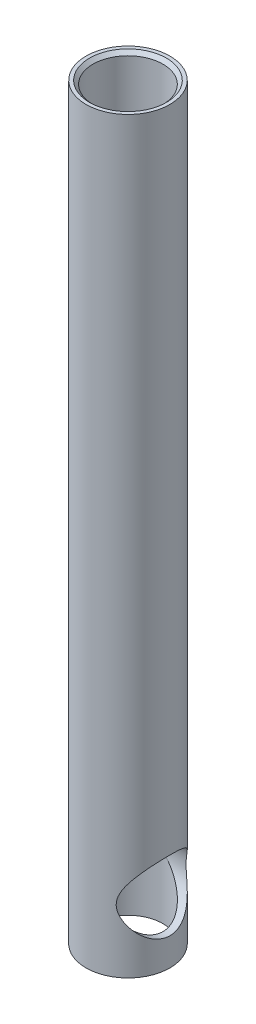
ISO-10303-21;
HEADER;
FILE_DESCRIPTION(('STEP AP214'),'2;1');
FILE_NAME('part.step','',(''),(''),'','','');
FILE_SCHEMA(('AUTOMOTIVE_DESIGN { 1 0 10303 214 1 1 1 1 }'));
ENDSEC;
DATA;
#1=APPLICATION_CONTEXT('core data for automotive mechanical design processes');
#2=APPLICATION_PROTOCOL_DEFINITION('international standard','automotive_design',2000,#1);
#3=PRODUCT_CONTEXT('',#1,'mechanical');
#4=PRODUCT('Part','Part','',(#3));
#5=PRODUCT_RELATED_PRODUCT_CATEGORY('part','',(#4));
#6=PRODUCT_DEFINITION_FORMATION('','',#4);
#7=PRODUCT_DEFINITION_CONTEXT('part definition',#1,'design');
#8=PRODUCT_DEFINITION('design','',#6,#7);
#9=PRODUCT_DEFINITION_SHAPE('','',#8);
#10=(LENGTH_UNIT() NAMED_UNIT(*) SI_UNIT(.MILLI.,.METRE.));
#11=(NAMED_UNIT(*) PLANE_ANGLE_UNIT() SI_UNIT($,.RADIAN.));
#12=(NAMED_UNIT(*) SI_UNIT($,.STERADIAN.) SOLID_ANGLE_UNIT());
#13=UNCERTAINTY_MEASURE_WITH_UNIT(LENGTH_MEASURE(1.E-05),#10,'distance_accuracy_value','');
#14=(GEOMETRIC_REPRESENTATION_CONTEXT(3) GLOBAL_UNCERTAINTY_ASSIGNED_CONTEXT((#13)) GLOBAL_UNIT_ASSIGNED_CONTEXT((#10,
#11,#12)) REPRESENTATION_CONTEXT('',''));
#15=CARTESIAN_POINT('',(0.,0.,0.));
#16=DIRECTION('',(0.,0.,1.));
#17=DIRECTION('',(1.,0.,0.));
#18=AXIS2_PLACEMENT_3D('',#15,#16,#17);
#19=CARTESIAN_POINT('',(47.,-137.99999999992,-12.));
#20=DIRECTION('',(0.,1.,0.));
#21=DIRECTION('',(0.,0.,1.));
#22=AXIS2_PLACEMENT_3D('',#19,#20,#21);
#23=CONICAL_SURFACE('',#22,5.50000000007185,0.785398163397448);
#24=CARTESIAN_POINT('',(47.,-138.5,-12.));
#25=DIRECTION('',(0.,1.,0.));
#26=DIRECTION('',(0.,0.,1.));
#27=AXIS2_PLACEMENT_3D('',#24,#25,#26);
#28=CIRCLE('',#27,5.);
#29=CARTESIAN_POINT('',(47.,-138.5,-7.));
#30=VERTEX_POINT('',#29);
#31=EDGE_CURVE('E54',#30,#30,#28,.F.);
#32=ORIENTED_EDGE('',*,*,#31,.T.);
#33=EDGE_LOOP('',(#32));
#34=FACE_BOUND('',#33,.T.);
#35=CARTESIAN_POINT('',(47.,-138.000000000034,-12.));
#36=DIRECTION('',(0.,1.,0.));
#37=DIRECTION('',(0.,0.,1.));
#38=AXIS2_PLACEMENT_3D('',#35,#36,#37);
#39=CIRCLE('',#38,5.49999999995816);
#40=CARTESIAN_POINT('',(47.,-138.000000000034,-6.50000000004184));
#41=VERTEX_POINT('',#40);
#42=EDGE_CURVE('E19',#41,#41,#39,.F.);
#43=ORIENTED_EDGE('',*,*,#42,.F.);
#44=EDGE_LOOP('',(#43));
#45=FACE_BOUND('',#44,.T.);
#46=ADVANCED_FACE('F16',(#34,#45),#23,.F.);
#47=CARTESIAN_POINT('',(47.,-141.,-12.));
#48=DIRECTION('',(0.,1.,0.));
#49=DIRECTION('',(0.,0.,1.));
#50=AXIS2_PLACEMENT_3D('',#47,#48,#49);
#51=CYLINDRICAL_SURFACE('',#50,5.);
#52=CARTESIAN_POINT('',(47.,-236.,-12.));
#53=DIRECTION('',(0.707106781186547,0.707106781186547,0.));
#54=DIRECTION('',(-0.707106781186547,0.707106781186547,0.));
#55=AXIS2_PLACEMENT_3D('',#52,#53,#54);
#56=ELLIPSE('',#55,7.07106781186547,5.);
#57=CARTESIAN_POINT('',(47.,-236.,-7.));
#58=VERTEX_POINT('',#57);
#59=CARTESIAN_POINT('',(47.,-236.,-17.));
#60=VERTEX_POINT('',#59);
#61=EDGE_CURVE('E33',#58,#60,#56,.T.);
#62=ORIENTED_EDGE('',*,*,#61,.T.);
#63=CARTESIAN_POINT('',(47.,-236.,-12.));
#64=DIRECTION('',(-0.707106781186547,0.707106781186547,0.));
#65=DIRECTION('',(0.707106781186547,0.707106781186547,0.));
#66=AXIS2_PLACEMENT_3D('',#63,#64,#65);
#67=ELLIPSE('',#66,7.07106781186547,5.);
#68=EDGE_CURVE('E31',#60,#58,#67,.F.);
#69=ORIENTED_EDGE('',*,*,#68,.T.);
#70=EDGE_LOOP('',(#62,#69));
#71=FACE_BOUND('',#70,.T.);
#72=CARTESIAN_POINT('',(47.,-245.,-12.));
#73=DIRECTION('',(0.,1.,0.));
#74=DIRECTION('',(0.,0.,1.));
#75=AXIS2_PLACEMENT_3D('',#72,#73,#74);
#76=CIRCLE('',#75,5.);
#77=CARTESIAN_POINT('',(47.,-245.,-7.));
#78=VERTEX_POINT('',#77);
#79=EDGE_CURVE('E37',#78,#78,#76,.T.);
#80=ORIENTED_EDGE('',*,*,#79,.F.);
#81=EDGE_LOOP('',(#80));
#82=FACE_BOUND('',#81,.T.);
#83=CARTESIAN_POINT('',(42.3162515012012,-234.,-13.7499999999999));
#84=CARTESIAN_POINT('',(42.3162527951404,-234.095007614222,-13.750001528267));
#85=CARTESIAN_POINT('',(42.3133291930724,-234.190004583141,-13.7422370284588));
#86=CARTESIAN_POINT('',(42.3020194603677,-234.377164613439,-13.7115028434308));
#87=CARTESIAN_POINT('',(42.2936328758612,-234.469327438688,-13.6885318948426));
#88=CARTESIAN_POINT('',(42.2724610119178,-234.648073341805,-13.628306285517));
#89=CARTESIAN_POINT('',(42.2596850848386,-234.734667822153,-13.591081975216));
#90=CARTESIAN_POINT('',(42.2311882178545,-234.900413383702,-13.5035116092416));
#91=CARTESIAN_POINT('',(42.2154665294691,-234.979562565455,-13.4531622173776));
#92=CARTESIAN_POINT('',(42.182088287539,-235.131589308391,-13.3384414698252));
#93=CARTESIAN_POINT('',(42.1643800190736,-235.204098921919,-13.2735974375935));
#94=CARTESIAN_POINT('',(42.1294587308286,-235.337468747017,-13.1327345812557));
#95=CARTESIAN_POINT('',(42.1122458005739,-235.398326863854,-13.056713752094));
#96=CARTESIAN_POINT('',(42.079649721427,-235.50837506446,-12.892925093026));
#97=CARTESIAN_POINT('',(42.0643344004975,-235.557174045038,-12.8048797870367));
#98=CARTESIAN_POINT('',(42.0378731987787,-235.639119808874,-12.6212007171066));
#99=CARTESIAN_POINT('',(42.0267260712507,-235.672271273204,-12.5255692326406));
#100=CARTESIAN_POINT('',(42.0102238280217,-235.720716788738,-12.333294441128));
#101=CARTESIAN_POINT('',(42.004664447447,-235.736642372526,-12.2368281190503));
#102=CARTESIAN_POINT('',(41.9992359252467,-235.75219808766,-12.0424428010718));
#103=CARTESIAN_POINT('',(41.9993651697358,-235.751832840778,-11.9445242250619));
#104=CARTESIAN_POINT('',(42.0051641765498,-235.735205191827,-11.7545057293149));
#105=CARTESIAN_POINT('',(42.0105944322303,-235.719629984831,-11.6623371428044));
#106=CARTESIAN_POINT('',(42.0260794132131,-235.674168486039,-11.482015769037));
#107=CARTESIAN_POINT('',(42.0361344590022,-235.644281202445,-11.39386326055));
#108=CARTESIAN_POINT('',(42.0600306515295,-235.570675348394,-11.222642584091));
#109=CARTESIAN_POINT('',(42.0739220571008,-235.526771873999,-11.1396612082596));
#110=CARTESIAN_POINT('',(42.1040603794836,-235.426536273338,-10.9820494129936));
#111=CARTESIAN_POINT('',(42.1203079954557,-235.370200455415,-10.9074214839721));
#112=CARTESIAN_POINT('',(42.1544493836345,-235.243293926551,-10.7645600404659));
#113=CARTESIAN_POINT('',(42.1723848382841,-235.172138982479,-10.6968546941248));
#114=CARTESIAN_POINT('',(42.2071881840143,-235.019348008117,-10.5741556080757));
#115=CARTESIAN_POINT('',(42.2240558731245,-234.937710003724,-10.5191642680648));
#116=CARTESIAN_POINT('',(42.2550558834384,-234.764439965444,-10.4226192339589));
#117=CARTESIAN_POINT('',(42.2691363977548,-234.672660688496,-10.381311865227));
#118=CARTESIAN_POINT('',(42.2923702273769,-234.482829325746,-10.3149262127684));
#119=CARTESIAN_POINT('',(42.3015258642183,-234.384780219908,-10.2898402812961));
#120=CARTESIAN_POINT('',(42.3133394704042,-234.190351625215,-10.2577333469087));
#121=CARTESIAN_POINT('',(42.3162945892353,-234.094126801197,-10.2498853136611));
#122=CARTESIAN_POINT('',(42.3162074883715,-233.901710419744,-10.2501171616197));
#123=CARTESIAN_POINT('',(42.3131665064193,-233.805518859542,-10.2581937555913));
#124=CARTESIAN_POINT('',(42.3017283223636,-233.619840940819,-10.2892995802321));
#125=CARTESIAN_POINT('',(42.2935458660937,-233.530239566537,-10.3117299527635));
#126=CARTESIAN_POINT('',(42.2729901367688,-233.356098465521,-10.3701746563992));
#127=CARTESIAN_POINT('',(42.2606160742796,-233.271559695796,-10.4061915464921));
#128=CARTESIAN_POINT('',(42.2325502416201,-233.106745277915,-10.4921774225831));
#129=CARTESIAN_POINT('',(42.2167597433031,-233.026713235815,-10.5425802152461));
#130=CARTESIAN_POINT('',(42.1838215651806,-232.875945775718,-10.6554274968347));
#131=CARTESIAN_POINT('',(42.1666734476508,-232.805213375835,-10.7178758789036));
#132=CARTESIAN_POINT('',(42.1318344048703,-232.671106357288,-10.8570337627572));
#133=CARTESIAN_POINT('',(42.1141640488505,-232.608333903678,-10.9343305575349));
#134=CARTESIAN_POINT('',(42.0811731358589,-232.496599098671,-11.0987970319387));
#135=CARTESIAN_POINT('',(42.0658525242985,-232.447636426427,-11.1859664821247));
#136=CARTESIAN_POINT('',(42.0393393188178,-232.365322869556,-11.3673919182841));
#137=CARTESIAN_POINT('',(42.0281238390621,-232.331885144837,-11.4616049773168));
#138=CARTESIAN_POINT('',(42.0109903158637,-232.281487209516,-11.6547926249652));
#139=CARTESIAN_POINT('',(42.0050701404222,-232.264520367162,-11.7537652803408));
#140=CARTESIAN_POINT('',(41.9993713513313,-232.248189793698,-11.9481815581237));
#141=CARTESIAN_POINT('',(41.9992924745803,-232.247965435764,-12.0435448173803));
#142=CARTESIAN_POINT('',(42.004528997899,-232.262968048124,-12.2328875369643));
#143=CARTESIAN_POINT('',(42.0098438822933,-232.278193541321,-12.3268671287072));
#144=CARTESIAN_POINT('',(42.0251493841601,-232.323077345933,-12.5089818197049));
#145=CARTESIAN_POINT('',(42.0350492610956,-232.352455989917,-12.5971940297301));
#146=CARTESIAN_POINT('',(42.0585026424648,-232.424546354922,-12.7674620135698));
#147=CARTESIAN_POINT('',(42.0720568260889,-232.467260554728,-12.8495166393064));
#148=CARTESIAN_POINT('',(42.1020983915211,-232.566727191481,-13.0086502931643));
#149=CARTESIAN_POINT('',(42.1186798654599,-232.623963940495,-13.0854085633653));
#150=CARTESIAN_POINT('',(42.1527130508953,-232.750051332813,-13.2285067805398));
#151=CARTESIAN_POINT('',(42.1701650526344,-232.81890586808,-13.2948432217679));
#152=CARTESIAN_POINT('',(42.2049043920466,-232.969918545107,-13.418221485263));
#153=CARTESIAN_POINT('',(42.222150085194,-233.052531333044,-13.4747204801433));
#154=CARTESIAN_POINT('',(42.2536015530469,-233.226623857158,-13.5730152599912));
#155=CARTESIAN_POINT('',(42.2678077210861,-233.318102443818,-13.6148129478513));
#156=CARTESIAN_POINT('',(42.291228979727,-233.506402148469,-13.6818841705692));
#157=CARTESIAN_POINT('',(42.3004976448379,-233.603152813275,-13.7073357197671));
#158=CARTESIAN_POINT('',(42.313006870947,-233.799940582663,-13.7413890466523));
#159=CARTESIAN_POINT('',(42.3162501389448,-233.899976190869,-13.7499983910437));
#160=CARTESIAN_POINT('',(42.3162515012012,-234.,-13.7499999999999));
#161=B_SPLINE_CURVE_WITH_KNOTS('',3,(#83,#84,#85,#86,#87,#88,#89,#90,#91,#92,#93,#94,#95,#96,
#97,#98,#99,#100,#101,#102,#103,#104,#105,#106,#107,#108,#109,#110,#111,#112,#113,#114,#115,
#116,#117,#118,#119,#120,#121,#122,#123,#124,#125,#126,#127,#128,#129,#130,#131,#132,#133,#134,
#135,#136,#137,#138,#139,#140,#141,#142,#143,#144,#145,#146,#147,#148,#149,#150,#151,#152,#153,
#154,#155,#156,#157,#158,#159,#160),.UNSPECIFIED.,.T.,.F.,(4,2,2,2,2,2,2,2,2,2,2,2,2,2,2,2,2,2,
2,2,2,2,2,2,2,2,2,2,2,2,2,2,2,2,2,2,2,2,4),(0.,0.284651635594197,0.569326923324718,
0.853399377903893,1.13754410978841,1.43283816033973,1.72818524979202,2.03212748646945,
2.33597873883101,2.6282673654451,2.92047306916395,3.2000599565196,3.47966622149222,
3.76312511804982,4.04666829838926,4.34483254952089,4.64305303162082,4.94638206951362,
5.2495679956781,5.53785739185872,5.82608728424854,6.10301294372741,6.37999078756695,
6.66641167236913,6.9529252841945,7.25488366573247,7.55683503120823,7.85707643107364,
8.15719689307682,8.44187881225604,8.72653351672764,9.00578077768929,9.28507997544031,
9.57531854538558,9.86565453910386,10.1688694665246,10.4720451322684,10.7718604827926,
11.0715411041912),.UNSPECIFIED.);
#162=CARTESIAN_POINT('',(42.3162515012012,-234.,-13.7499999999999));
#163=VERTEX_POINT('',#162);
#164=EDGE_CURVE('E44',#163,#163,#161,.T.);
#165=ORIENTED_EDGE('',*,*,#164,.T.);
#166=EDGE_LOOP('',(#165));
#167=FACE_BOUND('',#166,.T.);
#168=CARTESIAN_POINT('',(42.3162515012012,-223.,-13.75));
#169=CARTESIAN_POINT('',(42.3162527951404,-223.095007614222,-13.7500015282671));
#170=CARTESIAN_POINT('',(42.3133291930725,-223.190004583141,-13.7422370284589));
#171=CARTESIAN_POINT('',(42.3020194603677,-223.377164613439,-13.7115028434309));
#172=CARTESIAN_POINT('',(42.2936328758612,-223.469327438689,-13.6885318948427));
#173=CARTESIAN_POINT('',(42.2724610119177,-223.648073341805,-13.628306285517));
#174=CARTESIAN_POINT('',(42.2596850848386,-223.734667822153,-13.5910819752159));
#175=CARTESIAN_POINT('',(42.2311882178545,-223.900413383703,-13.5035116092415));
#176=CARTESIAN_POINT('',(42.2154665294691,-223.979562565455,-13.4531622173775));
#177=CARTESIAN_POINT('',(42.182088287539,-224.131589308392,-13.3384414698251));
#178=CARTESIAN_POINT('',(42.1643800190736,-224.204098921919,-13.2735974375934));
#179=CARTESIAN_POINT('',(42.1294587308286,-224.337468747017,-13.1327345812555));
#180=CARTESIAN_POINT('',(42.1122458005738,-224.398326863854,-13.0567137520938));
#181=CARTESIAN_POINT('',(42.0796497214269,-224.50837506446,-12.8929250930258));
#182=CARTESIAN_POINT('',(42.0643344004975,-224.557174045038,-12.8048797870365));
#183=CARTESIAN_POINT('',(42.0378731987787,-224.639119808874,-12.6212007171064));
#184=CARTESIAN_POINT('',(42.0267260712507,-224.672271273204,-12.5255692326404));
#185=CARTESIAN_POINT('',(42.0102238280216,-224.720716788738,-12.3332944411277));
#186=CARTESIAN_POINT('',(42.004664447447,-224.736642372526,-12.23682811905));
#187=CARTESIAN_POINT('',(41.9992359252467,-224.75219808766,-12.0424428010715));
#188=CARTESIAN_POINT('',(41.9993651697358,-224.751832840778,-11.9445242250616));
#189=CARTESIAN_POINT('',(42.0051641765498,-224.735205191827,-11.7545057293147));
#190=CARTESIAN_POINT('',(42.0105944322303,-224.719629984831,-11.6623371428042));
#191=CARTESIAN_POINT('',(42.0260794132131,-224.674168486039,-11.4820157690368));
#192=CARTESIAN_POINT('',(42.0361344590023,-224.644281202445,-11.3938632605498));
#193=CARTESIAN_POINT('',(42.0600306515296,-224.570675348394,-11.2226425840908));
#194=CARTESIAN_POINT('',(42.0739220571008,-224.526771873998,-11.1396612082594));
#195=CARTESIAN_POINT('',(42.1040603794837,-224.426536273338,-10.9820494129934));
#196=CARTESIAN_POINT('',(42.1203079954558,-224.370200455414,-10.9074214839719));
#197=CARTESIAN_POINT('',(42.1544493836345,-224.243293926551,-10.7645600404657));
#198=CARTESIAN_POINT('',(42.1723848382841,-224.172138982478,-10.6968546941247));
#199=CARTESIAN_POINT('',(42.2071881840143,-224.019348008116,-10.5741556080756));
#200=CARTESIAN_POINT('',(42.2240558731245,-223.937710003723,-10.5191642680647));
#201=CARTESIAN_POINT('',(42.2550558834384,-223.764439965444,-10.4226192339588));
#202=CARTESIAN_POINT('',(42.2691363977549,-223.672660688495,-10.3813118652269));
#203=CARTESIAN_POINT('',(42.2923702273769,-223.482829325745,-10.3149262127684));
#204=CARTESIAN_POINT('',(42.3015258642183,-223.384780219907,-10.2898402812961));
#205=CARTESIAN_POINT('',(42.3133394704042,-223.190351625215,-10.2577333469088));
#206=CARTESIAN_POINT('',(42.3162945892353,-223.094126801197,-10.2498853136612));
#207=CARTESIAN_POINT('',(42.3162074883715,-222.901710419744,-10.2501171616198));
#208=CARTESIAN_POINT('',(42.3131665064193,-222.805518859542,-10.2581937555914));
#209=CARTESIAN_POINT('',(42.3017283223636,-222.619840940819,-10.2892995802323));
#210=CARTESIAN_POINT('',(42.2935458660936,-222.530239566537,-10.3117299527637));
#211=CARTESIAN_POINT('',(42.2729901367688,-222.356098465521,-10.3701746563994));
#212=CARTESIAN_POINT('',(42.2606160742795,-222.271559695795,-10.4061915464923));
#213=CARTESIAN_POINT('',(42.23255024162,-222.106745277914,-10.4921774225833));
#214=CARTESIAN_POINT('',(42.216759743303,-222.026713235815,-10.5425802152464));
#215=CARTESIAN_POINT('',(42.1838215651805,-221.875945775718,-10.655427496835));
#216=CARTESIAN_POINT('',(42.1666734476507,-221.805213375835,-10.717875878904));
#217=CARTESIAN_POINT('',(42.1318344048702,-221.671106357288,-10.8570337627575));
#218=CARTESIAN_POINT('',(42.1141640488504,-221.608333903678,-10.9343305575352));
#219=CARTESIAN_POINT('',(42.0811731358588,-221.496599098671,-11.0987970319391));
#220=CARTESIAN_POINT('',(42.0658525242984,-221.447636426427,-11.1859664821251));
#221=CARTESIAN_POINT('',(42.0393393188177,-221.365322869556,-11.3673919182845));
#222=CARTESIAN_POINT('',(42.0281238390621,-221.331885144837,-11.4616049773173));
#223=CARTESIAN_POINT('',(42.0109903158636,-221.281487209516,-11.6547926249657));
#224=CARTESIAN_POINT('',(42.0050701404221,-221.264520367162,-11.7537652803413));
#225=CARTESIAN_POINT('',(41.9993713513313,-221.248189793698,-11.9481815581242));
#226=CARTESIAN_POINT('',(41.9992924745803,-221.247965435764,-12.0435448173807));
#227=CARTESIAN_POINT('',(42.004528997899,-221.262968048124,-12.2328875369647));
#228=CARTESIAN_POINT('',(42.0098438822933,-221.278193541321,-12.3268671287076));
#229=CARTESIAN_POINT('',(42.0251493841602,-221.323077345933,-12.5089818197053));
#230=CARTESIAN_POINT('',(42.0350492610956,-221.352455989917,-12.5971940297305));
#231=CARTESIAN_POINT('',(42.0585026424649,-221.424546354922,-12.7674620135702));
#232=CARTESIAN_POINT('',(42.072056826089,-221.467260554728,-12.8495166393067));
#233=CARTESIAN_POINT('',(42.1020983915212,-221.566727191481,-13.0086502931646));
#234=CARTESIAN_POINT('',(42.11867986546,-221.623963940495,-13.0854085633657));
#235=CARTESIAN_POINT('',(42.1527130508953,-221.750051332813,-13.2285067805402));
#236=CARTESIAN_POINT('',(42.1701650526345,-221.81890586808,-13.2948432217682));
#237=CARTESIAN_POINT('',(42.2049043920467,-221.969918545108,-13.4182214852634));
#238=CARTESIAN_POINT('',(42.222150085194,-222.052531333044,-13.4747204801436));
#239=CARTESIAN_POINT('',(42.253601553047,-222.226623857159,-13.5730152599914));
#240=CARTESIAN_POINT('',(42.2678077210862,-222.318102443818,-13.6148129478516));
#241=CARTESIAN_POINT('',(42.291228979727,-222.506402148469,-13.6818841705694));
#242=CARTESIAN_POINT('',(42.300497644838,-222.603152813275,-13.7073357197673));
#243=CARTESIAN_POINT('',(42.3130068709471,-222.799940582663,-13.7413890466524));
#244=CARTESIAN_POINT('',(42.3162501389448,-222.899976190869,-13.7499983910438));
#245=CARTESIAN_POINT('',(42.3162515012012,-223.,-13.75));
#246=B_SPLINE_CURVE_WITH_KNOTS('',3,(#168,#169,#170,#171,#172,#173,#174,#175,#176,#177,#178,
#179,#180,#181,#182,#183,#184,#185,#186,#187,#188,#189,#190,#191,#192,#193,#194,#195,#196,#197,
#198,#199,#200,#201,#202,#203,#204,#205,#206,#207,#208,#209,#210,#211,#212,#213,#214,#215,#216,
#217,#218,#219,#220,#221,#222,#223,#224,#225,#226,#227,#228,#229,#230,#231,#232,#233,#234,#235,
#236,#237,#238,#239,#240,#241,#242,#243,#244,#245),.UNSPECIFIED.,.T.,.F.,(4,2,2,2,2,2,2,2,2,2,2,
2,2,2,2,2,2,2,2,2,2,2,2,2,2,2,2,2,2,2,2,2,2,2,2,2,2,2,4),(0.,0.284651635594174,
0.569326923324709,0.853399377903878,1.13754410978842,1.43283816033972,1.72818524979204,
2.03212748646948,2.33597873883107,2.62826736544513,2.92047306916396,3.20005995651962,
3.47966622149222,3.76312511804986,4.04666829838928,4.34483254952089,4.64305303162084,
4.9463820695137,5.24956799567811,5.53785739185878,5.82608728424858,6.10301294372747,
6.37999078756697,6.66641167236916,6.95292528419453,7.25488366573249,7.55683503120828,
7.85707643107369,8.15719689307686,8.44187881225607,8.72653351672765,9.0057807776893,
9.28507997544031,9.57531854538559,9.8656545391039,10.1688694665246,10.4720451322684,
10.7718604827926,11.0715411041912),.UNSPECIFIED.);
#247=CARTESIAN_POINT('',(42.3162515012012,-223.,-13.75));
#248=VERTEX_POINT('',#247);
#249=EDGE_CURVE('E41',#248,#248,#246,.T.);
#250=ORIENTED_EDGE('',*,*,#249,.T.);
#251=EDGE_LOOP('',(#250));
#252=FACE_BOUND('',#251,.T.);
#253=ORIENTED_EDGE('',*,*,#31,.F.);
#254=EDGE_LOOP('',(#253));
#255=FACE_BOUND('',#254,.T.);
#256=ADVANCED_FACE('F39',(#71,#82,#167,#252,#255),#51,.F.);
#257=CARTESIAN_POINT('',(47.,-138.,-12.));
#258=DIRECTION('',(0.,1.,0.));
#259=DIRECTION('',(0.,0.,1.));
#260=AXIS2_PLACEMENT_3D('',#257,#258,#259);
#261=PLANE('',#260);
#262=ORIENTED_EDGE('',*,*,#42,.T.);
#263=EDGE_LOOP('',(#262));
#264=FACE_BOUND('',#263,.T.);
#265=CARTESIAN_POINT('',(47.,-138.,-12.));
#266=DIRECTION('',(0.,1.,0.));
#267=DIRECTION('',(0.,0.,1.));
#268=AXIS2_PLACEMENT_3D('',#265,#266,#267);
#269=CIRCLE('',#268,6.);
#270=CARTESIAN_POINT('',(47.,-138.,-6.));
#271=VERTEX_POINT('',#270);
#272=EDGE_CURVE('E85',#271,#271,#269,.F.);
#273=ORIENTED_EDGE('',*,*,#272,.F.);
#274=EDGE_LOOP('',(#273));
#275=FACE_BOUND('',#274,.T.);
#276=ADVANCED_FACE('F94',(#264,#275),#261,.T.);
#277=CARTESIAN_POINT('',(47.,-245.,-12.));
#278=DIRECTION('',(0.,-1.,0.));
#279=DIRECTION('',(1.,0.,0.));
#280=AXIS2_PLACEMENT_3D('',#277,#278,#279);
#281=PLANE('',#280);
#282=ORIENTED_EDGE('',*,*,#79,.T.);
#283=EDGE_LOOP('',(#282));
#284=FACE_BOUND('',#283,.T.);
#285=CARTESIAN_POINT('',(47.,-245.,-12.));
#286=DIRECTION('',(0.,1.,0.));
#287=DIRECTION('',(0.,0.,1.));
#288=AXIS2_PLACEMENT_3D('',#285,#286,#287);
#289=CIRCLE('',#288,6.);
#290=CARTESIAN_POINT('',(47.,-245.,-6.));
#291=VERTEX_POINT('',#290);
#292=EDGE_CURVE('E84',#291,#291,#289,.T.);
#293=ORIENTED_EDGE('',*,*,#292,.F.);
#294=EDGE_LOOP('',(#293));
#295=FACE_BOUND('',#294,.T.);
#296=ADVANCED_FACE('F90',(#284,#295),#281,.T.);
#297=CARTESIAN_POINT('',(69.,-236.,-12.));
#298=DIRECTION('',(-1.,0.,0.));
#299=DIRECTION('',(0.,0.,1.));
#300=AXIS2_PLACEMENT_3D('',#297,#298,#299);
#301=CYLINDRICAL_SURFACE('',#300,5.);
#302=ORIENTED_EDGE('',*,*,#61,.F.);
#303=ORIENTED_EDGE('',*,*,#68,.F.);
#304=EDGE_LOOP('',(#302,#303));
#305=FACE_BOUND('',#304,.T.);
#306=CARTESIAN_POINT('',(53.,-231.,-12.));
#307=CARTESIAN_POINT('',(52.9999995119656,-231.000000498224,-12.118676539074));
#308=CARTESIAN_POINT('',(52.9964713555416,-231.004232690553,-12.2373606359861));
#309=CARTESIAN_POINT('',(52.9824394345799,-231.021084170761,-12.4737626236399));
#310=CARTESIAN_POINT('',(52.971932428497,-231.033707356102,-12.5914800396417));
#311=CARTESIAN_POINT('',(52.9441603599397,-231.067137764324,-12.8251118948745));
#312=CARTESIAN_POINT('',(52.9268856996968,-231.087956610352,-12.9410235293597));
#313=CARTESIAN_POINT('',(52.8859636327002,-231.13741248374,-13.1700403437506));
#314=CARTESIAN_POINT('',(52.862313294689,-231.166053107291,-13.2831442065797));
#315=CARTESIAN_POINT('',(52.7828676534128,-231.262604681464,-13.6155355183217));
#316=CARTESIAN_POINT('',(52.7183530001786,-231.34141227087,-13.8296994730759));
#317=CARTESIAN_POINT('',(52.5705466948464,-231.524078638975,-14.2397898937143));
#318=CARTESIAN_POINT('',(52.4872534762141,-231.627939507705,-14.4357148361467));
#319=CARTESIAN_POINT('',(52.3352043529593,-231.820680671709,-14.7487466010889));
#320=CARTESIAN_POINT('',(52.2701572954027,-231.903943227885,-14.8712130042067));
#321=CARTESIAN_POINT('',(52.134961965575,-232.079417399202,-15.1065368370893));
#322=CARTESIAN_POINT('',(52.064813760206,-232.171628896981,-15.2193943928329));
#323=CARTESIAN_POINT('',(51.9206769279901,-232.36445628807,-15.4356770467755));
#324=CARTESIAN_POINT('',(51.84667831469,-232.465094495065,-15.539075480834));
#325=CARTESIAN_POINT('',(51.6964964142996,-232.673988371939,-15.7360751082745));
#326=CARTESIAN_POINT('',(51.6203134039261,-232.782243079472,-15.8296775356782));
#327=CARTESIAN_POINT('',(51.4659093248897,-233.008131643814,-16.008725425837));
#328=CARTESIAN_POINT('',(51.3876765317146,-233.125901307817,-16.0939893649262));
#329=CARTESIAN_POINT('',(51.232408815852,-233.369021817179,-16.2543115763776));
#330=CARTESIAN_POINT('',(51.1553743019371,-233.494375181254,-16.3293664308921));
#331=CARTESIAN_POINT('',(51.0050111702043,-233.752532031505,-16.4688213969413));
#332=CARTESIAN_POINT('',(50.9316741081625,-233.885316930333,-16.5332466283878));
#333=CARTESIAN_POINT('',(50.7915538903398,-234.158896075735,-16.6510742114483));
#334=CARTESIAN_POINT('',(50.724765175946,-234.299683366184,-16.7044859551855));
#335=CARTESIAN_POINT('',(50.5958362648676,-234.603323865691,-16.8038705886983));
#336=CARTESIAN_POINT('',(50.5347178232977,-234.767008631642,-16.8486777177338));
#337=CARTESIAN_POINT('',(50.4318718642768,-235.103819394677,-16.9220248001241));
#338=CARTESIAN_POINT('',(50.3900973048461,-235.276921331297,-16.9506042559552));
#339=CARTESIAN_POINT('',(50.346884325611,-235.54233803094,-16.9798243941834));
#340=CARTESIAN_POINT('',(50.3357137181967,-235.632381174336,-16.9872926076602));
#341=CARTESIAN_POINT('',(50.3206515533341,-235.813363816594,-16.9973356472221));
#342=CARTESIAN_POINT('',(50.3167593152601,-235.904303230843,-16.9999109308625));
#343=CARTESIAN_POINT('',(50.316497070849,-236.086194985147,-17.000084554943));
#344=CARTESIAN_POINT('',(50.3201270929428,-236.177147325249,-16.9976828765723));
#345=CARTESIAN_POINT('',(50.3346904393678,-236.358199640634,-16.9879770228475));
#346=CARTESIAN_POINT('',(50.3456246533175,-236.448299510733,-16.9806722503175));
#347=CARTESIAN_POINT('',(50.375383271077,-236.634290491761,-16.9605577554067));
#348=CARTESIAN_POINT('',(50.3947852114695,-236.73004461847,-16.9473428743318));
#349=CARTESIAN_POINT('',(50.4403876183873,-236.919072605341,-16.9157404367191));
#350=CARTESIAN_POINT('',(50.4665928940103,-237.012344659364,-16.8973492203903));
#351=CARTESIAN_POINT('',(50.5537436521572,-237.288268489152,-16.8348712960541));
#352=CARTESIAN_POINT('',(50.6231543786693,-237.466645522655,-16.783524066705));
#353=CARTESIAN_POINT('',(50.7600487130837,-237.775680757381,-16.6763222824087));
#354=CARTESIAN_POINT('',(50.8250079466202,-237.908622678462,-16.6235519546462));
#355=CARTESIAN_POINT('',(50.9604382962982,-238.167303370795,-16.5080868266026));
#356=CARTESIAN_POINT('',(51.0309126328747,-238.293037858048,-16.4453862055156));
#357=CARTESIAN_POINT('',(51.1749187944833,-238.537662859573,-16.3104307540217));
#358=CARTESIAN_POINT('',(51.2484546303925,-238.656543875993,-16.2381631013809));
#359=CARTESIAN_POINT('',(51.3965271155224,-238.887435686396,-16.0843539827642));
#360=CARTESIAN_POINT('',(51.4710635606288,-238.999447856357,-16.0028143835615));
#361=CARTESIAN_POINT('',(51.6234177266632,-239.22225663513,-15.8260070826314));
#362=CARTESIAN_POINT('',(51.7012032177947,-239.332683393946,-15.7302444796715));
#363=CARTESIAN_POINT('',(51.8544523042948,-239.5455832811,-15.5285052437944));
#364=CARTESIAN_POINT('',(51.9299155484881,-239.648055210025,-15.4225270759735));
#365=CARTESIAN_POINT('',(52.0768033209693,-239.84423566683,-15.200582285144));
#366=CARTESIAN_POINT('',(52.1482355710605,-239.937961191428,-15.0846359131844));
#367=CARTESIAN_POINT('',(52.2856570823189,-240.115989137599,-14.8427483412289));
#368=CARTESIAN_POINT('',(52.3516462301411,-240.200291362958,-14.7168069332076));
#369=CARTESIAN_POINT('',(52.5085586667123,-240.398817836767,-14.3882209634888));
#370=CARTESIAN_POINT('',(52.5950363867106,-240.506377685438,-14.1792129591824));
#371=CARTESIAN_POINT('',(52.7084445895072,-240.646188148557,-13.8512432493215));
#372=CARTESIAN_POINT('',(52.7435267615597,-240.68920042482,-13.739521434497));
#373=CARTESIAN_POINT('',(52.8076475107171,-240.76752348293,-13.5116895611229));
#374=CARTESIAN_POINT('',(52.8366867543867,-240.802835114217,-13.3955799882358));
#375=CARTESIAN_POINT('',(52.8847573103113,-240.861131808754,-13.1750213207255));
#376=CARTESIAN_POINT('',(52.9045980532305,-240.885121487994,-13.0710123428844));
#377=CARTESIAN_POINT('',(52.9388823082102,-240.926505648809,-12.8608191533537));
#378=CARTESIAN_POINT('',(52.9533265764255,-240.943901054379,-12.7546352486162));
#379=CARTESIAN_POINT('',(52.9765511638414,-240.97184313842,-12.5407477467602));
#380=CARTESIAN_POINT('',(52.9853312062494,-240.982389482199,-12.4330440756383));
#381=CARTESIAN_POINT('',(52.9970549862732,-240.996467108955,-12.2168952551015));
#382=CARTESIAN_POINT('',(53.0000004422207,-241.000000457315,-12.1084503334347));
#383=CARTESIAN_POINT('',(52.9999995156559,-240.999999499124,-11.8812193142869));
#384=CARTESIAN_POINT('',(52.9964651854443,-240.995759909229,-11.7624321367153));
#385=CARTESIAN_POINT('',(52.9824116185588,-240.978882414454,-11.5258723417448));
#386=CARTESIAN_POINT('',(52.9718918697061,-240.966243893755,-11.4080997993816));
#387=CARTESIAN_POINT('',(52.9441041994668,-240.932794560239,-11.1744949316231));
#388=CARTESIAN_POINT('',(52.9268344107065,-240.911981485954,-11.0586631523884));
#389=CARTESIAN_POINT('',(52.8859312540337,-240.862548305654,-10.8298048504729));
#390=CARTESIAN_POINT('',(52.862295076863,-240.833924753082,-10.7167795903127));
#391=CARTESIAN_POINT('',(52.7828746086514,-240.737403769778,-10.3844935455327));
#392=CARTESIAN_POINT('',(52.7183699787566,-240.658608460328,-10.1703567899968));
#393=CARTESIAN_POINT('',(52.5705685806527,-240.475948660824,-9.76026164698654));
#394=CARTESIAN_POINT('',(52.487265323336,-240.372075513272,-9.56430956973104));
#395=CARTESIAN_POINT('',(52.3352029985522,-240.17931760917,-9.25125059986765));
#396=CARTESIAN_POINT('',(52.2701544540356,-240.09605313172,-9.12878164339302));
#397=CARTESIAN_POINT('',(52.1349559477273,-239.920574742458,-8.89345309462098));
#398=CARTESIAN_POINT('',(52.0648060522793,-239.828360947028,-8.78059337739585));
#399=CARTESIAN_POINT('',(51.9206688997299,-239.635532813345,-8.56431157262023));
#400=CARTESIAN_POINT('',(51.8466718164419,-239.534896519094,-8.46091572175385));
#401=CARTESIAN_POINT('',(51.6964931109418,-239.326006980376,-8.263920831909));
#402=CARTESIAN_POINT('',(51.6203117650122,-239.217754696741,-8.17032056081369));
#403=CARTESIAN_POINT('',(51.4659194411767,-238.99188297894,-7.99128630813855));
#404=CARTESIAN_POINT('',(51.387696808902,-238.874128553591,-7.90603274034041));
#405=CARTESIAN_POINT('',(51.2324491106365,-238.631043167295,-7.7457288627037));
#406=CARTESIAN_POINT('',(51.1554244544705,-238.505709682254,-7.6706819793884));
#407=CARTESIAN_POINT('',(51.0050584174353,-238.247550329134,-7.53122053386692));
#408=CARTESIAN_POINT('',(50.9317095216097,-238.114741033998,-7.4667836067907));
#409=CARTESIAN_POINT('',(50.7915720751449,-237.841150596123,-7.34894062497491));
#410=CARTESIAN_POINT('',(50.7247779109726,-237.700376440393,-7.29552508741002));
#411=CARTESIAN_POINT('',(50.5934254770048,-237.390964719628,-7.19426967117639));
#412=CARTESIAN_POINT('',(50.5303381805521,-237.221107696989,-7.14810838473514));
#413=CARTESIAN_POINT('',(50.4515154788931,-236.959095149866,-7.0920381139104));
#414=CARTESIAN_POINT('',(50.427897429646,-236.870678548425,-7.07555683687266));
#415=CARTESIAN_POINT('',(50.386869413761,-236.6917065303,-7.04724959005989));
#416=CARTESIAN_POINT('',(50.3694556100276,-236.601152472636,-7.03542074245788));
#417=CARTESIAN_POINT('',(50.3428109512696,-236.425772496336,-7.01744504232906));
#418=CARTESIAN_POINT('',(50.3330365057472,-236.341068527309,-7.01091905188652));
#419=CARTESIAN_POINT('',(50.3199420069032,-236.170911051761,-7.00219570242074));
#420=CARTESIAN_POINT('',(50.3166236064712,-236.085457358919,-6.9999994519044));
#421=CARTESIAN_POINT('',(50.3166260151226,-235.911591543927,-7.00000056702297));
#422=CARTESIAN_POINT('',(50.3201800531675,-235.823179164205,-7.00235227639801));
#423=CARTESIAN_POINT('',(50.334184152957,-235.647138871161,-7.01168572519372));
#424=CARTESIAN_POINT('',(50.3446372913512,-235.559511325514,-7.01866953030159));
#425=CARTESIAN_POINT('',(50.3856552620611,-235.298507483786,-7.04636820959639));
#426=CARTESIAN_POINT('',(50.4258762082595,-235.127275488964,-7.07382958702225));
#427=CARTESIAN_POINT('',(50.5101526601126,-234.845232760287,-7.13373009611072));
#428=CARTESIAN_POINT('',(50.5492897681831,-234.731933740554,-7.16209082433252));
#429=CARTESIAN_POINT('',(50.6345116730953,-234.509986649569,-7.2257815828473));
#430=CARTESIAN_POINT('',(50.6805972057678,-234.401339072467,-7.26111235138248));
#431=CARTESIAN_POINT('',(50.7779451342248,-234.188403747785,-7.33834797376359));
#432=CARTESIAN_POINT('',(50.8292231509731,-234.084130575805,-7.38027288797573));
#433=CARTESIAN_POINT('',(50.9352481580763,-233.880152051728,-7.47024705606935));
#434=CARTESIAN_POINT('',(50.9899943461671,-233.780445652366,-7.51829489616641));
#435=CARTESIAN_POINT('',(51.1265862924837,-233.541929578552,-7.64302638830624));
#436=CARTESIAN_POINT('',(51.2096399722181,-233.405486881186,-7.72293158907248));
#437=CARTESIAN_POINT('',(51.3773635670181,-233.141382848822,-7.89474353843171));
#438=CARTESIAN_POINT('',(51.4620341616139,-233.013725314496,-7.98665543218785));
#439=CARTESIAN_POINT('',(51.6305073316117,-232.767407358687,-8.18227253266776));
#440=CARTESIAN_POINT('',(51.7143106896907,-232.648738076152,-8.28596586568032));
#441=CARTESIAN_POINT('',(51.8790086862537,-232.420765789953,-8.50513523517892));
#442=CARTESIAN_POINT('',(51.9599044230622,-232.31145922757,-8.62060675794947));
#443=CARTESIAN_POINT('',(52.1620480981895,-232.04291993891,-8.9332367536564));
#444=CARTESIAN_POINT('',(52.279783435978,-231.891074502453,-9.13921754790579));
#445=CARTESIAN_POINT('',(52.4955075358159,-231.61734757039,-9.57939014741175));
#446=CARTESIAN_POINT('',(52.5935217016694,-231.495427481361,-9.8135450304555));
#447=CARTESIAN_POINT('',(52.7475168989034,-231.305699232021,-10.2643501071986));
#448=CARTESIAN_POINT('',(52.8078302055447,-231.23218744265,-10.4770669146244));
#449=CARTESIAN_POINT('',(52.8809581393901,-231.143464448213,-10.8054496643754));
#450=CARTESIAN_POINT('',(52.9024364236684,-231.117489630658,-10.9163955503455));
#451=CARTESIAN_POINT('',(52.9392437459642,-231.073056294973,-11.1407686914862));
#452=CARTESIAN_POINT('',(52.9545753871489,-231.054594594908,-11.2541948747166));
#453=CARTESIAN_POINT('',(52.9777110769927,-231.026763312365,-11.4727621338652));
#454=CARTESIAN_POINT('',(52.9860546381979,-231.016741657157,-11.5777639401089));
#455=CARTESIAN_POINT('',(52.9971998967593,-231.003359082354,-11.7885083970382));
#456=CARTESIAN_POINT('',(53.0000004348715,-230.999999556049,-11.8942511980528));
#457=CARTESIAN_POINT('',(53.,-231.,-12.));
#458=B_SPLINE_CURVE_WITH_KNOTS('',3,(#306,#307,#308,#309,#310,#311,#312,#313,#314,#315,#316,
#317,#318,#319,#320,#321,#322,#323,#324,#325,#326,#327,#328,#329,#330,#331,#332,#333,#334,#335,
#336,#337,#338,#339,#340,#341,#342,#343,#344,#345,#346,#347,#348,#349,#350,#351,#352,#353,#354,
#355,#356,#357,#358,#359,#360,#361,#362,#363,#364,#365,#366,#367,#368,#369,#370,#371,#372,#373,
#374,#375,#376,#377,#378,#379,#380,#381,#382,#383,#384,#385,#386,#387,#388,#389,#390,#391,#392,
#393,#394,#395,#396,#397,#398,#399,#400,#401,#402,#403,#404,#405,#406,#407,#408,#409,#410,#411,
#412,#413,#414,#415,#416,#417,#418,#419,#420,#421,#422,#423,#424,#425,#426,#427,#428,#429,#430,
#431,#432,#433,#434,#435,#436,#437,#438,#439,#440,#441,#442,#443,#444,#445,#446,#447,#448,#449,
#450,#451,#452,#453,#454,#455,#456,#457),.UNSPECIFIED.,.T.,.F.,(4,2,2,2,2,2,2,2,2,2,2,2,2,2,2,2,
2,2,2,2,2,2,2,2,2,2,2,2,2,2,2,2,2,2,2,2,2,2,2,2,2,2,2,2,2,2,2,2,2,2,2,2,2,2,2,2,2,2,2,2,2,2,2,2,
2,2,2,2,2,2,2,2,2,2,2,4),(0.,0.355915557051173,0.711996545935203,1.06858436139426,
1.42533640074122,2.13342229400207,2.84156727865276,3.32621167322064,3.81084971278041,
4.29681430644294,4.78271760834152,5.2775508690647,5.77254938689955,6.26636082934715,
6.75974939974679,7.29936286797717,7.83765707913201,8.11040800071013,8.38313341512608,
8.65585986033028,8.9286195284721,9.22392745815355,9.51944470426636,10.1116379028107,
10.582376870339,11.0533927975794,11.5250465197658,11.9966054488336,12.492822912401,
12.9891150499304,13.4844217430243,13.97973874758,14.7276464212324,15.1015308674166,
15.4753740504255,15.8007444573101,16.1260692561355,16.451409951352,16.77665481692,
17.1328806295415,17.489132563933,17.8454831239513,18.2019911869893,18.9099842611345,
19.6182221026172,20.1028770667352,20.5875257289923,21.07347967846,21.5593724295586,
22.0541412907298,22.5490758447029,23.0429533800625,23.5364041937646,24.0952882670709,
24.3739716045751,24.6524822863691,24.9086913137456,25.1649659276505,25.430090467336,
25.6953333191111,26.2266035508294,26.5956996410277,26.9648348455977,27.3351155444172,
27.705310899765,28.2404188482582,28.7757568605264,29.3105600494086,29.8451590520658,
30.6868372225295,31.5274241454918,32.2232042813599,32.570696023704,32.9180404438235,
33.2351189089419,33.5522636794773),.UNSPECIFIED.);
#459=CARTESIAN_POINT('',(53.,-231.,-12.));
#460=VERTEX_POINT('',#459);
#461=EDGE_CURVE('E78',#460,#460,#458,.T.);
#462=ORIENTED_EDGE('',*,*,#461,.F.);
#463=EDGE_LOOP('',(#462));
#464=FACE_BOUND('',#463,.T.);
#465=ADVANCED_FACE('F34',(#305,#464),#301,.F.);
#466=CARTESIAN_POINT('',(25.,-223.,-12.));
#467=DIRECTION('',(1.,0.,0.));
#468=DIRECTION('',(0.,0.,-1.));
#469=AXIS2_PLACEMENT_3D('',#466,#467,#468);
#470=CYLINDRICAL_SURFACE('',#469,1.75);
#471=ORIENTED_EDGE('',*,*,#249,.F.);
#472=EDGE_LOOP('',(#471));
#473=FACE_BOUND('',#472,.T.);
#474=CARTESIAN_POINT('',(41.2608798583755,-223.,-13.75));
#475=CARTESIAN_POINT('',(41.2608786476678,-222.903972840044,-13.7499984814323));
#476=CARTESIAN_POINT('',(41.258443393159,-222.807930505552,-13.7420692020193));
#477=CARTESIAN_POINT('',(41.2490018074099,-222.618644844529,-13.7106375877228));
#478=CARTESIAN_POINT('',(41.2419937547699,-222.525402585901,-13.687129388205));
#479=CARTESIAN_POINT('',(41.2242663356259,-222.34448401726,-13.6253989101883));
#480=CARTESIAN_POINT('',(41.2135528929999,-222.256799085815,-13.5872001069921));
#481=CARTESIAN_POINT('',(41.1896297207063,-222.089062621044,-13.4972490348025));
#482=CARTESIAN_POINT('',(41.1764196625002,-222.009012094444,-13.44549498168));
#483=CARTESIAN_POINT('',(41.1485486199971,-221.856422359433,-13.3282455432938));
#484=CARTESIAN_POINT('',(41.1338580299999,-221.784145291388,-13.2624159670189));
#485=CARTESIAN_POINT('',(41.1049347538014,-221.651484379691,-13.1196009969224));
#486=CARTESIAN_POINT('',(41.0907021235088,-221.591101983591,-13.0426142472768));
#487=CARTESIAN_POINT('',(41.0639636379277,-221.482817952355,-12.8778177159703));
#488=CARTESIAN_POINT('',(41.0514967456396,-221.435181865225,-12.7898265746926));
#489=CARTESIAN_POINT('',(41.0300372680539,-221.355483085121,-12.6066577758348));
#490=CARTESIAN_POINT('',(41.0210439765635,-221.323417226334,-12.5114815837045));
#491=CARTESIAN_POINT('',(41.0077544412042,-221.276631659851,-12.3193853264157));
#492=CARTESIAN_POINT('',(41.0033373690923,-221.26146489068,-12.2225826531906));
#493=CARTESIAN_POINT('',(40.9992732381254,-221.247496260977,-12.0277126943123));
#494=CARTESIAN_POINT('',(40.999625230462,-221.248691145285,-11.9296456640823));
#495=CARTESIAN_POINT('',(41.004973343245,-221.267107975121,-11.7381606609898));
#496=CARTESIAN_POINT('',(41.0098292617433,-221.283846096452,-11.6446916267398));
#497=CARTESIAN_POINT('',(41.0234705177987,-221.332086208461,-11.461951873683));
#498=CARTESIAN_POINT('',(41.0322560986694,-221.363589113339,-11.3726814152187));
#499=CARTESIAN_POINT('',(41.0529670004038,-221.440803174694,-11.199700808773));
#500=CARTESIAN_POINT('',(41.064926488423,-221.48666998964,-11.1160644019917));
#501=CARTESIAN_POINT('',(41.0907113404574,-221.59118777611,-10.957517999245));
#502=CARTESIAN_POINT('',(41.1045371271952,-221.649841645797,-10.8826099874715));
#503=CARTESIAN_POINT('',(41.1331658932724,-221.780793665728,-10.7407585805915));
#504=CARTESIAN_POINT('',(41.1479861201607,-221.853511857527,-10.6742059297517));
#505=CARTESIAN_POINT('',(41.1764883190239,-222.009224209661,-10.5541333980886));
#506=CARTESIAN_POINT('',(41.1901701903155,-222.092219277337,-10.500614669263));
#507=CARTESIAN_POINT('',(41.2149258064317,-222.267110385987,-10.4077512146925));
#508=CARTESIAN_POINT('',(41.2259760354903,-222.359077031344,-10.368532736262));
#509=CARTESIAN_POINT('',(41.243935496772,-222.548705018148,-10.306251488354));
#510=CARTESIAN_POINT('',(41.2508459932928,-222.646364610927,-10.2831837859746));
#511=CARTESIAN_POINT('',(41.2594681408339,-222.840903917171,-10.2545743278024));
#512=CARTESIAN_POINT('',(41.2613550505567,-222.937689012116,-10.2484414675566));
#513=CARTESIAN_POINT('',(41.2601997016938,-223.130906224206,-10.2522307835442));
#514=CARTESIAN_POINT('',(41.2571580884521,-223.227338385907,-10.2621508577957));
#515=CARTESIAN_POINT('',(41.2466597338138,-223.414696831916,-10.2972393148686));
#516=CARTESIAN_POINT('',(41.2393113761996,-223.505699838873,-10.3220337188628));
#517=CARTESIAN_POINT('',(41.2211381431647,-223.682250196736,-10.3857368368374));
#518=CARTESIAN_POINT('',(41.2103127514182,-223.767796735115,-10.424647647159));
#519=CARTESIAN_POINT('',(41.1860602150833,-223.933427854009,-10.5166204787009));
#520=CARTESIAN_POINT('',(41.1725735294103,-224.013316396829,-10.5700194528886));
#521=CARTESIAN_POINT('',(41.1446489840927,-224.163215202527,-10.6890481877218));
#522=CARTESIAN_POINT('',(41.1302109099097,-224.233223226089,-10.7546807131779));
#523=CARTESIAN_POINT('',(41.1013919325925,-224.363924651428,-10.8990809872381));
#524=CARTESIAN_POINT('',(41.0870311375178,-224.42420070351,-10.9782314037965));
#525=CARTESIAN_POINT('',(41.0605018789893,-224.530621388009,-11.1458617734266));
#526=CARTESIAN_POINT('',(41.0483333028674,-224.576766746752,-11.2343412466646));
#527=CARTESIAN_POINT('',(41.0276359445364,-224.65317278485,-11.4175151208765));
#528=CARTESIAN_POINT('',(41.0190797889704,-224.683553340996,-11.5121562707447));
#529=CARTESIAN_POINT('',(41.006450389127,-224.727887338625,-11.7054931092097));
#530=CARTESIAN_POINT('',(41.0023759387587,-224.741845199762,-11.8041876995476));
#531=CARTESIAN_POINT('',(40.9992382172622,-224.752616575749,-11.9989625603804));
#532=CARTESIAN_POINT('',(40.9999975413175,-224.750037007174,-12.0950068407312));
#533=CARTESIAN_POINT('',(41.0060283217118,-224.72924676943,-12.2852357160143));
#534=CARTESIAN_POINT('',(41.0112995459208,-224.711036904413,-12.3794204063643));
#535=CARTESIAN_POINT('',(41.0257150724208,-224.65987089762,-12.5623764798953));
#536=CARTESIAN_POINT('',(41.0348214638543,-224.627058923269,-12.6511913712753));
#537=CARTESIAN_POINT('',(41.0559635100277,-224.547748556759,-12.8221033941953));
#538=CARTESIAN_POINT('',(41.0679996302982,-224.501247989251,-12.9041994553482));
#539=CARTESIAN_POINT('',(41.0941900669636,-224.394223451834,-13.0620796318378));
#540=CARTESIAN_POINT('',(41.1083980482387,-224.33331295026,-13.1375927588134));
#541=CARTESIAN_POINT('',(41.1371481695119,-224.19990313109,-13.277529657746));
#542=CARTESIAN_POINT('',(41.1516904024315,-224.127400556718,-13.3419503026926));
#543=CARTESIAN_POINT('',(41.1799343195533,-223.970452044107,-13.4596602267312));
#544=CARTESIAN_POINT('',(41.1936015513347,-223.88573085169,-13.5125916384519));
#545=CARTESIAN_POINT('',(41.2180148597613,-223.708205846536,-13.6033938898717));
#546=CARTESIAN_POINT('',(41.2287624767551,-223.615406330071,-13.6412726760319));
#547=CARTESIAN_POINT('',(41.2449426133353,-223.436072849872,-13.6970712650605));
#548=CARTESIAN_POINT('',(41.2508648097393,-223.350163062052,-13.7168670626942));
#549=CARTESIAN_POINT('',(41.258833649568,-223.176172852081,-13.7433309817063));
#550=CARTESIAN_POINT('',(41.2608809690471,-223.088092811295,-13.7500013930944));
#551=CARTESIAN_POINT('',(41.2608798583755,-223.,-13.75));
#552=B_SPLINE_CURVE_WITH_KNOTS('',3,(#474,#475,#476,#477,#478,#479,#480,#481,#482,#483,#484,
#485,#486,#487,#488,#489,#490,#491,#492,#493,#494,#495,#496,#497,#498,#499,#500,#501,#502,#503,
#504,#505,#506,#507,#508,#509,#510,#511,#512,#513,#514,#515,#516,#517,#518,#519,#520,#521,#522,
#523,#524,#525,#526,#527,#528,#529,#530,#531,#532,#533,#534,#535,#536,#537,#538,#539,#540,#541,
#542,#543,#544,#545,#546,#547,#548,#549,#550,#551),.UNSPECIFIED.,.T.,.F.,(4,2,2,2,2,2,2,2,2,2,2,
2,2,2,2,2,2,2,2,2,2,2,2,2,2,2,2,2,2,2,2,2,2,2,2,2,2,2,4),(0.,0.287756797222563,
0.575621981143375,0.863029060661779,1.15047398745512,1.44570366788231,1.74096925486198,
2.04197684943757,2.34292321606982,2.63570371118685,2.92842595829136,3.21233131865287,
3.49625426008393,3.78336718563484,4.07054525263204,4.36821044004192,4.66590192692268,
4.96616130350708,5.26632893237124,5.5558783051326,5.84538976717714,6.12791051105675,
6.41047322755234,6.70027379224021,6.99013993210849,7.29026491272893,7.59037446414682,
7.8881672241191,8.18587982418321,8.47273065365001,8.75956672600381,9.04363159851128,
9.3277416380938,9.62056977394219,9.91348032442505,10.2145064741217,10.5153734967277,
10.7794001445159,11.0433807230145),.UNSPECIFIED.);
#553=CARTESIAN_POINT('',(41.2608798583755,-223.,-13.75));
#554=VERTEX_POINT('',#553);
#555=EDGE_CURVE('E25',#554,#554,#552,.T.);
#556=ORIENTED_EDGE('',*,*,#555,.F.);
#557=EDGE_LOOP('',(#556));
#558=FACE_BOUND('',#557,.T.);
#559=ADVANCED_FACE('F89',(#473,#558),#470,.F.);
#560=CARTESIAN_POINT('',(25.,-234.,-11.9999999999999));
#561=DIRECTION('',(1.,0.,0.));
#562=DIRECTION('',(0.,0.,-1.));
#563=AXIS2_PLACEMENT_3D('',#560,#561,#562);
#564=CYLINDRICAL_SURFACE('',#563,1.75);
#565=ORIENTED_EDGE('',*,*,#164,.F.);
#566=EDGE_LOOP('',(#565));
#567=FACE_BOUND('',#566,.T.);
#568=CARTESIAN_POINT('',(41.2608798583755,-234.,-13.7499999999999));
#569=CARTESIAN_POINT('',(41.2608786476678,-233.903972840045,-13.7499984814322));
#570=CARTESIAN_POINT('',(41.2584433931589,-233.807930505552,-13.7420692020192));
#571=CARTESIAN_POINT('',(41.2490018074099,-233.618644844529,-13.7106375877227));
#572=CARTESIAN_POINT('',(41.2419937547698,-233.525402585901,-13.6871293882049));
#573=CARTESIAN_POINT('',(41.2242663356258,-233.34448401726,-13.6253989101882));
#574=CARTESIAN_POINT('',(41.2135528929999,-233.256799085815,-13.587200106992));
#575=CARTESIAN_POINT('',(41.1896297207063,-233.089062621044,-13.4972490348024));
#576=CARTESIAN_POINT('',(41.1764196625002,-233.009012094445,-13.4454949816799));
#577=CARTESIAN_POINT('',(41.1485486199971,-232.856422359433,-13.3282455432937));
#578=CARTESIAN_POINT('',(41.1338580299999,-232.784145291388,-13.2624159670188));
#579=CARTESIAN_POINT('',(41.1049347538014,-232.651484379691,-13.1196009969223));
#580=CARTESIAN_POINT('',(41.0907021235087,-232.591101983591,-13.0426142472767));
#581=CARTESIAN_POINT('',(41.0639636379277,-232.482817952355,-12.8778177159702));
#582=CARTESIAN_POINT('',(41.0514967456396,-232.435181865225,-12.7898265746925));
#583=CARTESIAN_POINT('',(41.0300372680539,-232.355483085121,-12.6066577758347));
#584=CARTESIAN_POINT('',(41.0210439765635,-232.323417226334,-12.5114815837044));
#585=CARTESIAN_POINT('',(41.0077544412042,-232.276631659851,-12.3193853264155));
#586=CARTESIAN_POINT('',(41.0033373690923,-232.26146489068,-12.2225826531905));
#587=CARTESIAN_POINT('',(40.9992732381254,-232.247496260977,-12.0277126943122));
#588=CARTESIAN_POINT('',(40.999625230462,-232.248691145285,-11.9296456640822));
#589=CARTESIAN_POINT('',(41.004973343245,-232.267107975121,-11.7381606609897));
#590=CARTESIAN_POINT('',(41.0098292617434,-232.283846096452,-11.6446916267397));
#591=CARTESIAN_POINT('',(41.0234705177987,-232.332086208461,-11.4619518736829));
#592=CARTESIAN_POINT('',(41.0322560986694,-232.363589113339,-11.3726814152186));
#593=CARTESIAN_POINT('',(41.0529670004038,-232.440803174694,-11.1997008087729));
#594=CARTESIAN_POINT('',(41.064926488423,-232.48666998964,-11.1160644019916));
#595=CARTESIAN_POINT('',(41.0907113404574,-232.59118777611,-10.9575179992449));
#596=CARTESIAN_POINT('',(41.1045371271953,-232.649841645797,-10.8826099874714));
#597=CARTESIAN_POINT('',(41.1331658932724,-232.780793665728,-10.7407585805914));
#598=CARTESIAN_POINT('',(41.1479861201607,-232.853511857527,-10.6742059297516));
#599=CARTESIAN_POINT('',(41.176488319024,-233.009224209662,-10.5541333980885));
#600=CARTESIAN_POINT('',(41.1901701903155,-233.092219277337,-10.5006146692629));
#601=CARTESIAN_POINT('',(41.2149258064317,-233.267110385987,-10.4077512146924));
#602=CARTESIAN_POINT('',(41.2259760354904,-233.359077031344,-10.3685327362619));
#603=CARTESIAN_POINT('',(41.2439354967721,-233.548705018148,-10.3062514883539));
#604=CARTESIAN_POINT('',(41.2508459932928,-233.646364610927,-10.2831837859745));
#605=CARTESIAN_POINT('',(41.2594681408339,-233.840903917171,-10.2545743278023));
#606=CARTESIAN_POINT('',(41.2613550505568,-233.937689012116,-10.2484414675565));
#607=CARTESIAN_POINT('',(41.2601997016939,-234.130906224206,-10.2522307835441));
#608=CARTESIAN_POINT('',(41.2571580884521,-234.227338385907,-10.2621508577956));
#609=CARTESIAN_POINT('',(41.2466597338139,-234.414696831916,-10.2972393148685));
#610=CARTESIAN_POINT('',(41.2393113761997,-234.505699838873,-10.3220337188627));
#611=CARTESIAN_POINT('',(41.2211381431647,-234.682250196736,-10.3857368368373));
#612=CARTESIAN_POINT('',(41.2103127514182,-234.767796735115,-10.4246476471589));
#613=CARTESIAN_POINT('',(41.1860602150833,-234.933427854009,-10.5166204787008));
#614=CARTESIAN_POINT('',(41.1725735294104,-235.013316396829,-10.5700194528885));
#615=CARTESIAN_POINT('',(41.1446489840927,-235.163215202527,-10.6890481877217));
#616=CARTESIAN_POINT('',(41.1302109099097,-235.233223226089,-10.7546807131778));
#617=CARTESIAN_POINT('',(41.1013919325926,-235.363924651428,-10.899080987238));
#618=CARTESIAN_POINT('',(41.0870311375178,-235.42420070351,-10.9782314037964));
#619=CARTESIAN_POINT('',(41.0605018789893,-235.530621388009,-11.1458617734265));
#620=CARTESIAN_POINT('',(41.0483333028674,-235.576766746752,-11.2343412466645));
#621=CARTESIAN_POINT('',(41.0276359445364,-235.65317278485,-11.4175151208764));
#622=CARTESIAN_POINT('',(41.0190797889704,-235.683553340996,-11.5121562707446));
#623=CARTESIAN_POINT('',(41.006450389127,-235.727887338625,-11.7054931092096));
#624=CARTESIAN_POINT('',(41.0023759387588,-235.741845199762,-11.8041876995475));
#625=CARTESIAN_POINT('',(40.9992382172622,-235.752616575749,-11.9989625603803));
#626=CARTESIAN_POINT('',(40.9999975413175,-235.750037007174,-12.0950068407311));
#627=CARTESIAN_POINT('',(41.0060283217117,-235.72924676943,-12.2852357160142));
#628=CARTESIAN_POINT('',(41.0112995459208,-235.711036904413,-12.3794204063642));
#629=CARTESIAN_POINT('',(41.0257150724208,-235.65987089762,-12.5623764798952));
#630=CARTESIAN_POINT('',(41.0348214638543,-235.627058923269,-12.6511913712752));
#631=CARTESIAN_POINT('',(41.0559635100277,-235.547748556759,-12.8221033941952));
#632=CARTESIAN_POINT('',(41.0679996302982,-235.501247989251,-12.9041994553481));
#633=CARTESIAN_POINT('',(41.0941900669636,-235.394223451834,-13.0620796318377));
#634=CARTESIAN_POINT('',(41.1083980482387,-235.33331295026,-13.1375927588133));
#635=CARTESIAN_POINT('',(41.1371481695119,-235.19990313109,-13.2775296577459));
#636=CARTESIAN_POINT('',(41.1516904024315,-235.127400556718,-13.3419503026925));
#637=CARTESIAN_POINT('',(41.1799343195532,-234.970452044107,-13.4596602267311));
#638=CARTESIAN_POINT('',(41.1936015513347,-234.88573085169,-13.5125916384518));
#639=CARTESIAN_POINT('',(41.2180148597612,-234.708205846536,-13.6033938898716));
#640=CARTESIAN_POINT('',(41.2287624767551,-234.615406330071,-13.6412726760318));
#641=CARTESIAN_POINT('',(41.2449426133352,-234.436072849872,-13.6970712650604));
#642=CARTESIAN_POINT('',(41.2508648097393,-234.350163062052,-13.7168670626941));
#643=CARTESIAN_POINT('',(41.258833649568,-234.176172852081,-13.7433309817062));
#644=CARTESIAN_POINT('',(41.2608809690471,-234.088092811295,-13.7500013930943));
#645=CARTESIAN_POINT('',(41.2608798583755,-234.,-13.7499999999999));
#646=B_SPLINE_CURVE_WITH_KNOTS('',3,(#568,#569,#570,#571,#572,#573,#574,#575,#576,#577,#578,
#579,#580,#581,#582,#583,#584,#585,#586,#587,#588,#589,#590,#591,#592,#593,#594,#595,#596,#597,
#598,#599,#600,#601,#602,#603,#604,#605,#606,#607,#608,#609,#610,#611,#612,#613,#614,#615,#616,
#617,#618,#619,#620,#621,#622,#623,#624,#625,#626,#627,#628,#629,#630,#631,#632,#633,#634,#635,
#636,#637,#638,#639,#640,#641,#642,#643,#644,#645),.UNSPECIFIED.,.T.,.F.,(4,2,2,2,2,2,2,2,2,2,2,
2,2,2,2,2,2,2,2,2,2,2,2,2,2,2,2,2,2,2,2,2,2,2,2,2,2,2,4),(0.,0.287756797222535,
0.575621981143375,0.863029060661779,1.15047398745512,1.44570366788231,1.74096925486198,
2.0419768494376,2.34292321606982,2.63570371118685,2.92842595829136,3.21233131865287,
3.49625426008394,3.78336718563484,4.07054525263204,4.36821044004192,4.66590192692268,
4.96616130350709,5.26632893237128,5.55587830513263,5.84538976717714,6.12791051105675,
6.41047322755234,6.70027379224021,6.99013993210849,7.29026491272896,7.59037446414683,
7.88816722411911,8.18587982418322,8.47273065365002,8.75956672600381,9.04363159851129,
9.32774163809381,9.62056977394217,9.91348032442506,10.2145064741218,10.5153734967277,
10.779400144516,11.0433807230145),.UNSPECIFIED.);
#647=CARTESIAN_POINT('',(41.2608798583755,-234.,-13.7499999999999));
#648=VERTEX_POINT('',#647);
#649=EDGE_CURVE('E10',#648,#648,#646,.T.);
#650=ORIENTED_EDGE('',*,*,#649,.F.);
#651=EDGE_LOOP('',(#650));
#652=FACE_BOUND('',#651,.T.);
#653=ADVANCED_FACE('F69',(#567,#652),#564,.F.);
#654=CARTESIAN_POINT('',(47.,-141.,-12.));
#655=DIRECTION('',(0.,1.,0.));
#656=DIRECTION('',(0.,0.,1.));
#657=AXIS2_PLACEMENT_3D('',#654,#655,#656);
#658=CYLINDRICAL_SURFACE('',#657,6.);
#659=ORIENTED_EDGE('',*,*,#461,.T.);
#660=EDGE_LOOP('',(#659));
#661=FACE_BOUND('',#660,.T.);
#662=ORIENTED_EDGE('',*,*,#292,.T.);
#663=EDGE_LOOP('',(#662));
#664=FACE_BOUND('',#663,.T.);
#665=ORIENTED_EDGE('',*,*,#649,.T.);
#666=EDGE_LOOP('',(#665));
#667=FACE_BOUND('',#666,.T.);
#668=ORIENTED_EDGE('',*,*,#555,.T.);
#669=EDGE_LOOP('',(#668));
#670=FACE_BOUND('',#669,.T.);
#671=ORIENTED_EDGE('',*,*,#272,.T.);
#672=EDGE_LOOP('',(#671));
#673=FACE_BOUND('',#672,.T.);
#674=ADVANCED_FACE('F71',(#661,#664,#667,#670,#673),#658,.T.);
#675=CLOSED_SHELL('',(#46,#256,#276,#296,#465,#559,#653,#674));
#676=MANIFOLD_SOLID_BREP('B1',#675);
#677=ADVANCED_BREP_SHAPE_REPRESENTATION('',(#18,#676),#14);
#678=SHAPE_DEFINITION_REPRESENTATION(#9,#677);
ENDSEC;
END-ISO-10303-21;
